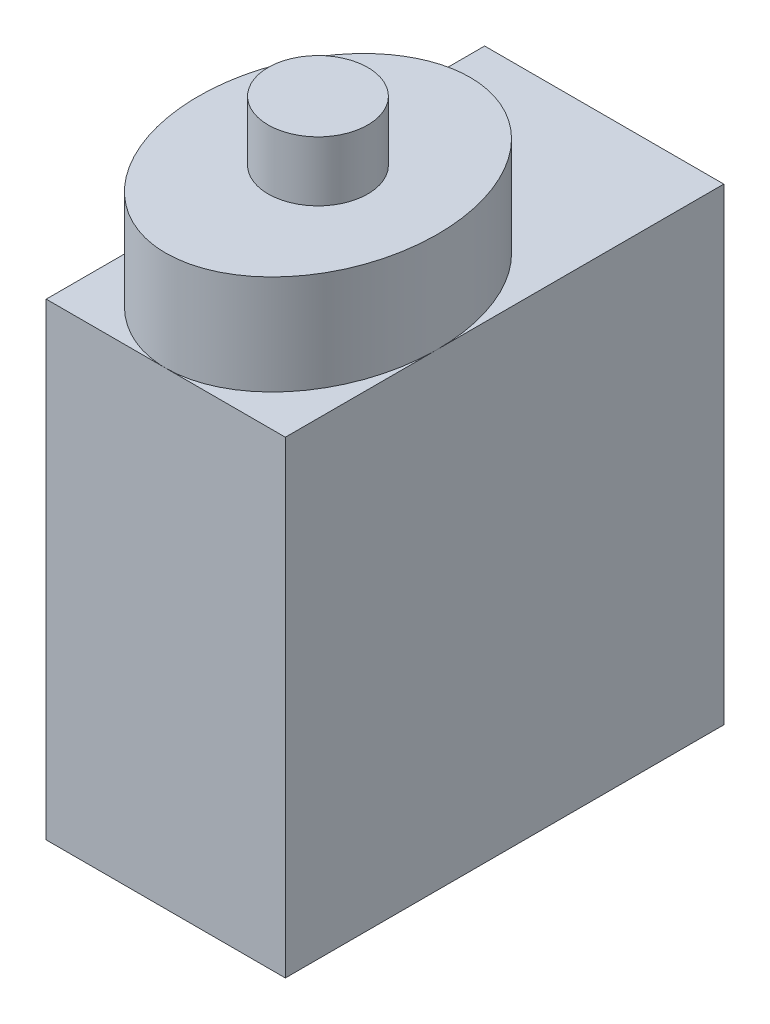
ISO-10303-21;
HEADER;
FILE_DESCRIPTION(('STEP AP214'),'2;1');
FILE_NAME('part.step','',(''),(''),'','','');
FILE_SCHEMA(('AUTOMOTIVE_DESIGN { 1 0 10303 214 1 1 1 1 }'));
ENDSEC;
DATA;
#1=APPLICATION_CONTEXT('core data for automotive mechanical design processes');
#2=APPLICATION_PROTOCOL_DEFINITION('international standard','automotive_design',2000,#1);
#3=PRODUCT_CONTEXT('',#1,'mechanical');
#4=PRODUCT('Part','Part','',(#3));
#5=PRODUCT_RELATED_PRODUCT_CATEGORY('part','',(#4));
#6=PRODUCT_DEFINITION_FORMATION('','',#4);
#7=PRODUCT_DEFINITION_CONTEXT('part definition',#1,'design');
#8=PRODUCT_DEFINITION('design','',#6,#7);
#9=PRODUCT_DEFINITION_SHAPE('','',#8);
#10=(LENGTH_UNIT() NAMED_UNIT(*) SI_UNIT(.MILLI.,.METRE.));
#11=(NAMED_UNIT(*) PLANE_ANGLE_UNIT() SI_UNIT($,.RADIAN.));
#12=(NAMED_UNIT(*) SI_UNIT($,.STERADIAN.) SOLID_ANGLE_UNIT());
#13=UNCERTAINTY_MEASURE_WITH_UNIT(LENGTH_MEASURE(1.E-05),#10,'distance_accuracy_value','');
#14=(GEOMETRIC_REPRESENTATION_CONTEXT(3) GLOBAL_UNCERTAINTY_ASSIGNED_CONTEXT((#13)) GLOBAL_UNIT_ASSIGNED_CONTEXT((#10,
#11,#12)) REPRESENTATION_CONTEXT('',''));
#15=CARTESIAN_POINT('',(0.,0.,0.));
#16=DIRECTION('',(0.,0.,1.));
#17=DIRECTION('',(1.,0.,0.));
#18=AXIS2_PLACEMENT_3D('',#15,#16,#17);
#19=CARTESIAN_POINT('',(0.,23.5,0.));
#20=DIRECTION('',(0.,-1.,0.));
#21=DIRECTION('',(0.,0.,-1.));
#22=AXIS2_PLACEMENT_3D('',#19,#20,#21);
#23=PLANE('',#22);
#24=CARTESIAN_POINT('',(0.,23.5,3.36279938547911));
#25=DIRECTION('',(0.,1.,0.));
#26=DIRECTION('',(0.,0.,1.));
#27=AXIS2_PLACEMENT_3D('',#24,#25,#26);
#28=ELLIPSE('',#27,7.6372006145209,6.);
#29=CARTESIAN_POINT('',(0.,23.5,11.));
#30=VERTEX_POINT('',#29);
#31=CARTESIAN_POINT('',(6.,23.5,3.36279938547911));
#32=VERTEX_POINT('',#31);
#33=EDGE_CURVE('E115',#30,#32,#28,.T.);
#34=ORIENTED_EDGE('',*,*,#33,.F.);
#35=DIRECTION('',(1.,0.,0.));
#36=VECTOR('',#35,1.);
#37=CARTESIAN_POINT('',(-6.,23.5,11.));
#38=LINE('',#37,#36);
#39=CARTESIAN_POINT('',(6.,23.5,11.));
#40=VERTEX_POINT('',#39);
#41=EDGE_CURVE('E102',#30,#40,#38,.T.);
#42=ORIENTED_EDGE('',*,*,#41,.T.);
#43=DIRECTION('',(0.,0.,-1.));
#44=VECTOR('',#43,1.);
#45=CARTESIAN_POINT('',(6.,23.5,11.));
#46=LINE('',#45,#44);
#47=EDGE_CURVE('E116',#40,#32,#46,.T.);
#48=ORIENTED_EDGE('',*,*,#47,.T.);
#49=EDGE_LOOP('',(#34,#42,#48));
#50=FACE_BOUND('',#49,.T.);
#51=ADVANCED_FACE('F41',(#50),#23,.F.);
#52=CARTESIAN_POINT('',(-6.,23.5,3.36279938547911));
#53=VERTEX_POINT('',#52);
#54=EDGE_CURVE('E51',#32,#53,#28,.T.);
#55=ORIENTED_EDGE('',*,*,#54,.F.);
#56=CARTESIAN_POINT('',(6.,23.5,-11.));
#57=VERTEX_POINT('',#56);
#58=EDGE_CURVE('E134',#32,#57,#46,.T.);
#59=ORIENTED_EDGE('',*,*,#58,.T.);
#60=DIRECTION('',(-1.,0.,0.));
#61=VECTOR('',#60,1.);
#62=CARTESIAN_POINT('',(-6.,23.5,-11.));
#63=LINE('',#62,#61);
#64=CARTESIAN_POINT('',(-6.,23.5,-11.));
#65=VERTEX_POINT('',#64);
#66=EDGE_CURVE('E133',#57,#65,#63,.T.);
#67=ORIENTED_EDGE('',*,*,#66,.T.);
#68=DIRECTION('',(0.,0.,1.));
#69=VECTOR('',#68,1.);
#70=CARTESIAN_POINT('',(-6.,23.5,11.));
#71=LINE('',#70,#69);
#72=EDGE_CURVE('E113',#65,#53,#71,.T.);
#73=ORIENTED_EDGE('',*,*,#72,.T.);
#74=EDGE_LOOP('',(#55,#59,#67,#73));
#75=FACE_BOUND('',#74,.T.);
#76=ADVANCED_FACE('F186',(#75),#23,.F.);
#77=CARTESIAN_POINT('',(6.,16.,11.));
#78=DIRECTION('',(-1.,0.,0.));
#79=DIRECTION('',(0.,0.,1.));
#80=AXIS2_PLACEMENT_3D('',#77,#78,#79);
#81=PLANE('',#80);
#82=DIRECTION('',(0.,-1.,0.));
#83=VECTOR('',#82,1.);
#84=CARTESIAN_POINT('',(6.,16.,-11.));
#85=LINE('',#84,#83);
#86=CARTESIAN_POINT('',(6.,0.,-11.));
#87=VERTEX_POINT('',#86);
#88=EDGE_CURVE('E45',#57,#87,#85,.T.);
#89=ORIENTED_EDGE('',*,*,#88,.F.);
#90=ORIENTED_EDGE('',*,*,#58,.F.);
#91=ORIENTED_EDGE('',*,*,#47,.F.);
#92=DIRECTION('',(0.,-1.,0.));
#93=VECTOR('',#92,1.);
#94=CARTESIAN_POINT('',(6.,16.,11.));
#95=LINE('',#94,#93);
#96=CARTESIAN_POINT('',(6.,0.,11.));
#97=VERTEX_POINT('',#96);
#98=EDGE_CURVE('E108',#40,#97,#95,.T.);
#99=ORIENTED_EDGE('',*,*,#98,.T.);
#100=DIRECTION('',(0.,0.,-1.));
#101=VECTOR('',#100,1.);
#102=CARTESIAN_POINT('',(6.,0.,11.));
#103=LINE('',#102,#101);
#104=EDGE_CURVE('E101',#97,#87,#103,.T.);
#105=ORIENTED_EDGE('',*,*,#104,.T.);
#106=EDGE_LOOP('',(#89,#90,#91,#99,#105));
#107=FACE_BOUND('',#106,.T.);
#108=ADVANCED_FACE('F43',(#107),#81,.F.);
#109=CARTESIAN_POINT('',(-6.,16.,-11.));
#110=DIRECTION('',(0.,0.,1.));
#111=DIRECTION('',(1.,0.,0.));
#112=AXIS2_PLACEMENT_3D('',#109,#110,#111);
#113=PLANE('',#112);
#114=DIRECTION('',(-1.,0.,0.));
#115=VECTOR('',#114,1.);
#116=CARTESIAN_POINT('',(-6.,0.,-11.));
#117=LINE('',#116,#115);
#118=CARTESIAN_POINT('',(-6.,0.,-11.));
#119=VERTEX_POINT('',#118);
#120=EDGE_CURVE('E143',#87,#119,#117,.T.);
#121=ORIENTED_EDGE('',*,*,#120,.T.);
#122=DIRECTION('',(0.,-1.,0.));
#123=VECTOR('',#122,1.);
#124=CARTESIAN_POINT('',(-6.,16.,-11.));
#125=LINE('',#124,#123);
#126=EDGE_CURVE('E127',#65,#119,#125,.T.);
#127=ORIENTED_EDGE('',*,*,#126,.F.);
#128=ORIENTED_EDGE('',*,*,#66,.F.);
#129=ORIENTED_EDGE('',*,*,#88,.T.);
#130=EDGE_LOOP('',(#121,#127,#128,#129));
#131=FACE_BOUND('',#130,.T.);
#132=ADVANCED_FACE('F197',(#131),#113,.F.);
#133=CARTESIAN_POINT('',(-6.,16.,11.));
#134=DIRECTION('',(1.,0.,0.));
#135=DIRECTION('',(0.,0.,-1.));
#136=AXIS2_PLACEMENT_3D('',#133,#134,#135);
#137=PLANE('',#136);
#138=ORIENTED_EDGE('',*,*,#72,.F.);
#139=ORIENTED_EDGE('',*,*,#126,.T.);
#140=DIRECTION('',(0.,0.,1.));
#141=VECTOR('',#140,1.);
#142=CARTESIAN_POINT('',(-6.,0.,11.));
#143=LINE('',#142,#141);
#144=CARTESIAN_POINT('',(-6.,0.,11.));
#145=VERTEX_POINT('',#144);
#146=EDGE_CURVE('E146',#119,#145,#143,.T.);
#147=ORIENTED_EDGE('',*,*,#146,.T.);
#148=DIRECTION('',(0.,-1.,0.));
#149=VECTOR('',#148,1.);
#150=CARTESIAN_POINT('',(-6.,16.,11.));
#151=LINE('',#150,#149);
#152=CARTESIAN_POINT('',(-6.,23.5,11.));
#153=VERTEX_POINT('',#152);
#154=EDGE_CURVE('E154',#153,#145,#151,.T.);
#155=ORIENTED_EDGE('',*,*,#154,.F.);
#156=EDGE_CURVE('E97',#53,#153,#71,.T.);
#157=ORIENTED_EDGE('',*,*,#156,.F.);
#158=EDGE_LOOP('',(#138,#139,#147,#155,#157));
#159=FACE_BOUND('',#158,.T.);
#160=ADVANCED_FACE('F161',(#159),#137,.F.);
#161=CARTESIAN_POINT('',(-6.,16.,11.));
#162=DIRECTION('',(0.,0.,-1.));
#163=DIRECTION('',(-1.,0.,0.));
#164=AXIS2_PLACEMENT_3D('',#161,#162,#163);
#165=PLANE('',#164);
#166=DIRECTION('',(1.,0.,0.));
#167=VECTOR('',#166,1.);
#168=CARTESIAN_POINT('',(-6.,0.,11.));
#169=LINE('',#168,#167);
#170=EDGE_CURVE('E149',#145,#97,#169,.T.);
#171=ORIENTED_EDGE('',*,*,#170,.T.);
#172=ORIENTED_EDGE('',*,*,#98,.F.);
#173=ORIENTED_EDGE('',*,*,#41,.F.);
#174=EDGE_CURVE('E94',#153,#30,#38,.T.);
#175=ORIENTED_EDGE('',*,*,#174,.F.);
#176=ORIENTED_EDGE('',*,*,#154,.T.);
#177=EDGE_LOOP('',(#171,#172,#173,#175,#176));
#178=FACE_BOUND('',#177,.T.);
#179=ADVANCED_FACE('F106',(#178),#165,.F.);
#180=CARTESIAN_POINT('',(0.,0.,0.));
#181=DIRECTION('',(0.,-1.,0.));
#182=DIRECTION('',(0.,0.,-1.));
#183=AXIS2_PLACEMENT_3D('',#180,#181,#182);
#184=PLANE('',#183);
#185=ORIENTED_EDGE('',*,*,#104,.F.);
#186=ORIENTED_EDGE('',*,*,#170,.F.);
#187=ORIENTED_EDGE('',*,*,#146,.F.);
#188=ORIENTED_EDGE('',*,*,#120,.F.);
#189=EDGE_LOOP('',(#185,#186,#187,#188));
#190=FACE_BOUND('',#189,.T.);
#191=ADVANCED_FACE('F167',(#190),#184,.T.);
#192=EDGE_CURVE('E59',#53,#30,#28,.T.);
#193=ORIENTED_EDGE('',*,*,#192,.F.);
#194=ORIENTED_EDGE('',*,*,#156,.T.);
#195=ORIENTED_EDGE('',*,*,#174,.T.);
#196=EDGE_LOOP('',(#193,#194,#195));
#197=FACE_BOUND('',#196,.T.);
#198=ADVANCED_FACE('F96',(#197),#23,.F.);
#199=CARTESIAN_POINT('',(0.,28.5,3.36279938547911));
#200=DIRECTION('',(0.,1.,0.));
#201=DIRECTION('',(0.,0.,1.));
#202=AXIS2_PLACEMENT_3D('',#199,#200,#201);
#203=ELLIPSE('',#202,7.6372006145209,6.);
#204=DIRECTION('',(0.,-1.,0.));
#205=VECTOR('',#204,1.);
#206=SURFACE_OF_LINEAR_EXTRUSION('',#203,#205);
#207=CARTESIAN_POINT('',(0.,28.5,11.));
#208=VERTEX_POINT('',#207);
#209=EDGE_CURVE('E119',#208,#208,#203,.T.);
#210=ORIENTED_EDGE('',*,*,#209,.F.);
#211=EDGE_LOOP('',(#210));
#212=FACE_BOUND('',#211,.T.);
#213=ORIENTED_EDGE('',*,*,#33,.T.);
#214=ORIENTED_EDGE('',*,*,#54,.T.);
#215=ORIENTED_EDGE('',*,*,#192,.T.);
#216=EDGE_LOOP('',(#213,#214,#215));
#217=FACE_BOUND('',#216,.T.);
#218=ADVANCED_FACE('F122',(#212,#217),#206,.F.);
#219=CARTESIAN_POINT('',(0.,28.5,3.36279938547911));
#220=DIRECTION('',(0.,1.,0.));
#221=DIRECTION('',(0.,0.,1.));
#222=AXIS2_PLACEMENT_3D('',#219,#220,#221);
#223=PLANE('',#222);
#224=CARTESIAN_POINT('',(0.,28.5,3.36279938547911));
#225=DIRECTION('',(0.,1.,0.));
#226=DIRECTION('',(0.,0.,1.));
#227=AXIS2_PLACEMENT_3D('',#224,#225,#226);
#228=CIRCLE('',#227,2.5);
#229=CARTESIAN_POINT('',(0.,28.5,5.86279938547911));
#230=VERTEX_POINT('',#229);
#231=EDGE_CURVE('E11',#230,#230,#228,.T.);
#232=ORIENTED_EDGE('',*,*,#231,.F.);
#233=EDGE_LOOP('',(#232));
#234=FACE_BOUND('',#233,.T.);
#235=ORIENTED_EDGE('',*,*,#209,.T.);
#236=EDGE_LOOP('',(#235));
#237=FACE_BOUND('',#236,.T.);
#238=ADVANCED_FACE('F174',(#234,#237),#223,.T.);
#239=CARTESIAN_POINT('',(0.,31.5,3.36279938547911));
#240=DIRECTION('',(0.,-1.,0.));
#241=DIRECTION('',(0.,0.,-1.));
#242=AXIS2_PLACEMENT_3D('',#239,#240,#241);
#243=CYLINDRICAL_SURFACE('',#242,2.5);
#244=CARTESIAN_POINT('',(0.,31.5,3.36279938547911));
#245=DIRECTION('',(0.,1.,0.));
#246=DIRECTION('',(0.,0.,1.));
#247=AXIS2_PLACEMENT_3D('',#244,#245,#246);
#248=CIRCLE('',#247,2.5);
#249=CARTESIAN_POINT('',(0.,31.5,5.86279938547911));
#250=VERTEX_POINT('',#249);
#251=EDGE_CURVE('E120',#250,#250,#248,.T.);
#252=ORIENTED_EDGE('',*,*,#251,.F.);
#253=EDGE_LOOP('',(#252));
#254=FACE_BOUND('',#253,.T.);
#255=ORIENTED_EDGE('',*,*,#231,.T.);
#256=EDGE_LOOP('',(#255));
#257=FACE_BOUND('',#256,.T.);
#258=ADVANCED_FACE('F182',(#254,#257),#243,.T.);
#259=CARTESIAN_POINT('',(0.,31.5,3.36279938547911));
#260=DIRECTION('',(0.,1.,0.));
#261=DIRECTION('',(0.,0.,1.));
#262=AXIS2_PLACEMENT_3D('',#259,#260,#261);
#263=PLANE('',#262);
#264=ORIENTED_EDGE('',*,*,#251,.T.);
#265=EDGE_LOOP('',(#264));
#266=FACE_BOUND('',#265,.T.);
#267=ADVANCED_FACE('F237',(#266),#263,.T.);
#268=CLOSED_SHELL('',(#51,#76,#108,#132,#160,#179,#191,#198,#218,#238,#258,#267));
#269=MANIFOLD_SOLID_BREP('B2',#268);
#270=ADVANCED_BREP_SHAPE_REPRESENTATION('',(#18,#269),#14);
#271=SHAPE_DEFINITION_REPRESENTATION(#9,#270);
ENDSEC;
END-ISO-10303-21;
